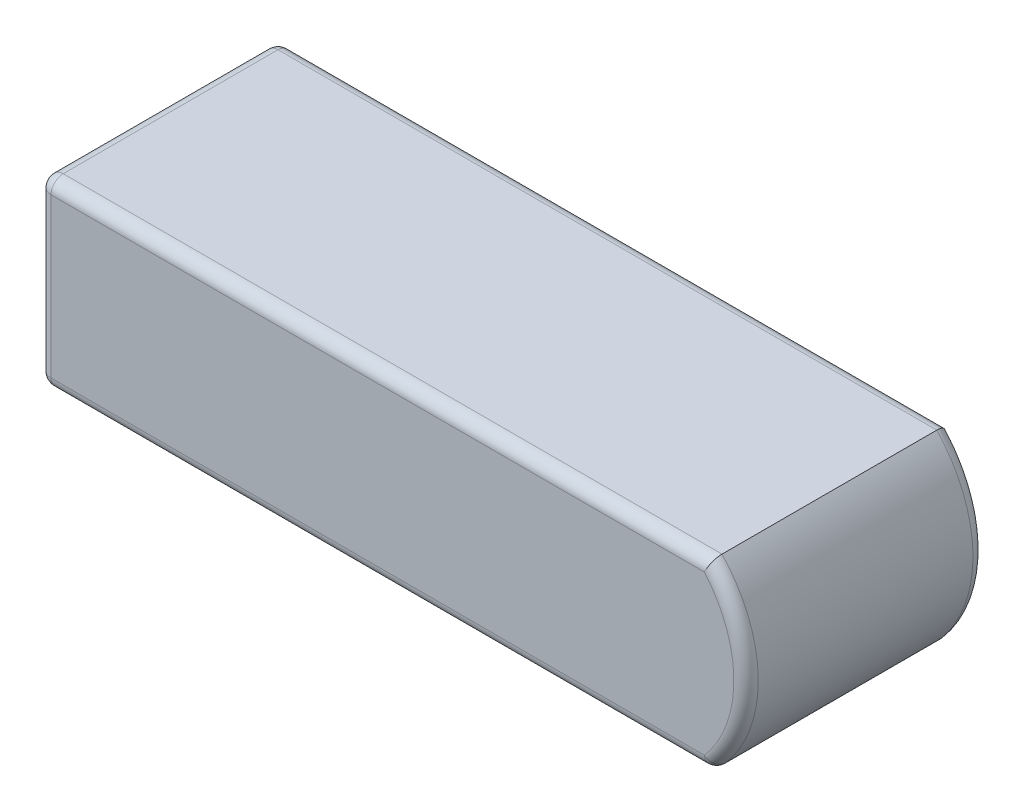
ISO-10303-21;
HEADER;
FILE_DESCRIPTION(('STEP AP214'),'2;1');
FILE_NAME('part.step','',(''),(''),'','','');
FILE_SCHEMA(('AUTOMOTIVE_DESIGN { 1 0 10303 214 1 1 1 1 }'));
ENDSEC;
DATA;
#1=APPLICATION_CONTEXT('core data for automotive mechanical design processes');
#2=APPLICATION_PROTOCOL_DEFINITION('international standard','automotive_design',2000,#1);
#3=PRODUCT_CONTEXT('',#1,'mechanical');
#4=PRODUCT('Part','Part','',(#3));
#5=PRODUCT_RELATED_PRODUCT_CATEGORY('part','',(#4));
#6=PRODUCT_DEFINITION_FORMATION('','',#4);
#7=PRODUCT_DEFINITION_CONTEXT('part definition',#1,'design');
#8=PRODUCT_DEFINITION('design','',#6,#7);
#9=PRODUCT_DEFINITION_SHAPE('','',#8);
#10=(LENGTH_UNIT() NAMED_UNIT(*) SI_UNIT(.MILLI.,.METRE.));
#11=(NAMED_UNIT(*) PLANE_ANGLE_UNIT() SI_UNIT($,.RADIAN.));
#12=(NAMED_UNIT(*) SI_UNIT($,.STERADIAN.) SOLID_ANGLE_UNIT());
#13=UNCERTAINTY_MEASURE_WITH_UNIT(LENGTH_MEASURE(1.E-05),#10,'distance_accuracy_value','');
#14=(GEOMETRIC_REPRESENTATION_CONTEXT(3) GLOBAL_UNCERTAINTY_ASSIGNED_CONTEXT((#13)) GLOBAL_UNIT_ASSIGNED_CONTEXT((#10,
#11,#12)) REPRESENTATION_CONTEXT('',''));
#15=CARTESIAN_POINT('',(0.,0.,0.));
#16=DIRECTION('',(0.,0.,1.));
#17=DIRECTION('',(1.,0.,0.));
#18=AXIS2_PLACEMENT_3D('',#15,#16,#17);
#19=CARTESIAN_POINT('',(69.2840315505781,1.27,-44.3108067642662));
#20=DIRECTION('',(0.,0.,1.));
#21=DIRECTION('',(1.,0.,0.));
#22=AXIS2_PLACEMENT_3D('',#19,#20,#21);
#23=CYLINDRICAL_SURFACE('',#22,1.27);
#24=CARTESIAN_POINT('',(69.2840315505781,1.27,-23.622));
#25=DIRECTION('',(0.,0.,-1.));
#26=DIRECTION('',(-1.,0.,0.));
#27=AXIS2_PLACEMENT_3D('',#24,#25,#26);
#28=CIRCLE('',#27,1.27);
#29=CARTESIAN_POINT('',(70.2467217052993,0.44167176433311,-23.622));
#30=VERTEX_POINT('',#29);
#31=CARTESIAN_POINT('',(69.2840315505761,0.,-23.622));
#32=VERTEX_POINT('',#31);
#33=EDGE_CURVE('E11',#30,#32,#28,.T.);
#34=ORIENTED_EDGE('',*,*,#33,.F.);
#35=DIRECTION('',(0.,0.,1.));
#36=VECTOR('',#35,1.);
#37=CARTESIAN_POINT('',(70.2467217052993,0.441671764333108,-44.3108067642662));
#38=LINE('',#37,#36);
#39=CARTESIAN_POINT('',(70.2467217052993,0.441671764333108,-1.27));
#40=VERTEX_POINT('',#39);
#41=EDGE_CURVE('E239',#40,#30,#38,.F.);
#42=ORIENTED_EDGE('',*,*,#41,.F.);
#43=CARTESIAN_POINT('',(69.2840315505781,1.27,-1.27));
#44=DIRECTION('',(0.,0.,-1.));
#45=DIRECTION('',(-1.,0.,0.));
#46=AXIS2_PLACEMENT_3D('',#43,#44,#45);
#47=CIRCLE('',#46,1.27);
#48=CARTESIAN_POINT('',(69.2840315505781,0.,-1.27));
#49=VERTEX_POINT('',#48);
#50=EDGE_CURVE('E43',#40,#49,#47,.T.);
#51=ORIENTED_EDGE('',*,*,#50,.T.);
#52=DIRECTION('',(0.,0.,1.));
#53=VECTOR('',#52,1.);
#54=CARTESIAN_POINT('',(69.2840315505781,0.,-24.892));
#55=LINE('',#54,#53);
#56=EDGE_CURVE('E230',#32,#49,#55,.T.);
#57=ORIENTED_EDGE('',*,*,#56,.F.);
#58=EDGE_LOOP('',(#34,#42,#51,#57));
#59=FACE_BOUND('',#58,.T.);
#60=ADVANCED_FACE('F35',(#59),#23,.T.);
#61=CARTESIAN_POINT('',(69.2840315505781,1.27,-1.27));
#62=DIRECTION('',(0.,0.,1.));
#63=DIRECTION('',(1.,0.,0.));
#64=AXIS2_PLACEMENT_3D('',#61,#62,#63);
#65=SPHERICAL_SURFACE('',#64,1.27);
#66=ORIENTED_EDGE('',*,*,#50,.F.);
#67=CARTESIAN_POINT('',(69.2840315505781,1.27,-1.27));
#68=DIRECTION('',(-0.652226957218023,-0.758023743874899,0.));
#69=DIRECTION('',(0.758023743874899,-0.652226957218023,0.));
#70=AXIS2_PLACEMENT_3D('',#67,#68,#69);
#71=CIRCLE('',#70,1.27);
#72=CARTESIAN_POINT('',(69.2840315505781,1.27,0.));
#73=VERTEX_POINT('',#72);
#74=EDGE_CURVE('E236',#73,#40,#71,.F.);
#75=ORIENTED_EDGE('',*,*,#74,.F.);
#76=CARTESIAN_POINT('',(69.2840315505781,1.27,-1.27));
#77=DIRECTION('',(1.,0.,0.));
#78=DIRECTION('',(0.,0.,-1.));
#79=AXIS2_PLACEMENT_3D('',#76,#77,#78);
#80=CIRCLE('',#79,1.27);
#81=EDGE_CURVE('E249',#73,#49,#80,.T.);
#82=ORIENTED_EDGE('',*,*,#81,.T.);
#83=EDGE_LOOP('',(#66,#75,#82));
#84=FACE_BOUND('',#83,.T.);
#85=ADVANCED_FACE('F252',(#84),#65,.T.);
#86=CARTESIAN_POINT('',(0.,1.27,-1.27));
#87=DIRECTION('',(-1.,0.,0.));
#88=DIRECTION('',(0.,0.,1.));
#89=AXIS2_PLACEMENT_3D('',#86,#87,#88);
#90=CYLINDRICAL_SURFACE('',#89,1.27);
#91=ORIENTED_EDGE('',*,*,#81,.F.);
#92=DIRECTION('',(1.,0.,0.));
#93=VECTOR('',#92,1.);
#94=CARTESIAN_POINT('',(0.,1.27,0.));
#95=LINE('',#94,#93);
#96=CARTESIAN_POINT('',(1.27,1.27,0.));
#97=VERTEX_POINT('',#96);
#98=EDGE_CURVE('E227',#97,#73,#95,.T.);
#99=ORIENTED_EDGE('',*,*,#98,.F.);
#100=CARTESIAN_POINT('',(1.27,1.27,-1.27));
#101=DIRECTION('',(1.,0.,0.));
#102=DIRECTION('',(0.,0.,-1.));
#103=AXIS2_PLACEMENT_3D('',#100,#101,#102);
#104=CIRCLE('',#103,1.27);
#105=CARTESIAN_POINT('',(1.27,0.,-1.27));
#106=VERTEX_POINT('',#105);
#107=EDGE_CURVE('E247',#97,#106,#104,.T.);
#108=ORIENTED_EDGE('',*,*,#107,.T.);
#109=DIRECTION('',(1.,0.,0.));
#110=VECTOR('',#109,1.);
#111=CARTESIAN_POINT('',(0.,0.,-1.27));
#112=LINE('',#111,#110);
#113=EDGE_CURVE('E233',#49,#106,#112,.F.);
#114=ORIENTED_EDGE('',*,*,#113,.F.);
#115=EDGE_LOOP('',(#91,#99,#108,#114));
#116=FACE_BOUND('',#115,.T.);
#117=ADVANCED_FACE('F255',(#116),#90,.T.);
#118=CARTESIAN_POINT('',(1.27,1.27,-1.27));
#119=DIRECTION('',(0.,0.,1.));
#120=DIRECTION('',(1.,0.,0.));
#121=AXIS2_PLACEMENT_3D('',#118,#119,#120);
#122=SPHERICAL_SURFACE('',#121,1.27);
#123=ORIENTED_EDGE('',*,*,#107,.F.);
#124=CARTESIAN_POINT('',(1.27,1.27,-1.27));
#125=DIRECTION('',(0.,-1.,0.));
#126=DIRECTION('',(0.,0.,-1.));
#127=AXIS2_PLACEMENT_3D('',#124,#125,#126);
#128=CIRCLE('',#127,1.27);
#129=CARTESIAN_POINT('',(0.,1.27,-1.27));
#130=VERTEX_POINT('',#129);
#131=EDGE_CURVE('E223',#130,#97,#128,.F.);
#132=ORIENTED_EDGE('',*,*,#131,.F.);
#133=CARTESIAN_POINT('',(1.27,1.27,-1.27));
#134=DIRECTION('',(0.,0.,-1.));
#135=DIRECTION('',(-1.,0.,0.));
#136=AXIS2_PLACEMENT_3D('',#133,#134,#135);
#137=CIRCLE('',#136,1.27);
#138=EDGE_CURVE('E145',#106,#130,#137,.T.);
#139=ORIENTED_EDGE('',*,*,#138,.F.);
#140=EDGE_LOOP('',(#123,#132,#139));
#141=FACE_BOUND('',#140,.T.);
#142=ADVANCED_FACE('F318',(#141),#122,.T.);
#143=CARTESIAN_POINT('',(69.2840315505781,1.27,-23.622));
#144=DIRECTION('',(0.,0.,1.));
#145=DIRECTION('',(1.,0.,0.));
#146=AXIS2_PLACEMENT_3D('',#143,#144,#145);
#147=SPHERICAL_SURFACE('',#146,1.27);
#148=CARTESIAN_POINT('',(69.2840315505781,1.27,-23.622));
#149=DIRECTION('',(-0.652226957218023,-0.758023743874899,0.));
#150=DIRECTION('',(0.758023743874899,-0.652226957218023,0.));
#151=AXIS2_PLACEMENT_3D('',#148,#149,#150);
#152=CIRCLE('',#151,1.27);
#153=CARTESIAN_POINT('',(69.2840315505781,1.27,-24.892));
#154=VERTEX_POINT('',#153);
#155=EDGE_CURVE('E245',#30,#154,#152,.F.);
#156=ORIENTED_EDGE('',*,*,#155,.F.);
#157=ORIENTED_EDGE('',*,*,#33,.T.);
#158=CARTESIAN_POINT('',(69.2840315505781,1.27,-23.622));
#159=DIRECTION('',(1.,0.,0.));
#160=DIRECTION('',(0.,0.,-1.));
#161=AXIS2_PLACEMENT_3D('',#158,#159,#160);
#162=CIRCLE('',#161,1.27);
#163=EDGE_CURVE('E242',#154,#32,#162,.F.);
#164=ORIENTED_EDGE('',*,*,#163,.F.);
#165=EDGE_LOOP('',(#156,#157,#164));
#166=FACE_BOUND('',#165,.T.);
#167=ADVANCED_FACE('F37',(#166),#147,.T.);
#168=CARTESIAN_POINT('',(0.,1.27,-23.622));
#169=DIRECTION('',(1.,0.,0.));
#170=DIRECTION('',(0.,0.,-1.));
#171=AXIS2_PLACEMENT_3D('',#168,#169,#170);
#172=CYLINDRICAL_SURFACE('',#171,1.27);
#173=DIRECTION('',(-1.,0.,0.));
#174=VECTOR('',#173,1.);
#175=CARTESIAN_POINT('',(0.,1.27,-24.892));
#176=LINE('',#175,#174);
#177=CARTESIAN_POINT('',(1.27,1.27,-24.892));
#178=VERTEX_POINT('',#177);
#179=EDGE_CURVE('E272',#154,#178,#176,.T.);
#180=ORIENTED_EDGE('',*,*,#179,.F.);
#181=ORIENTED_EDGE('',*,*,#163,.T.);
#182=DIRECTION('',(-1.,0.,0.));
#183=VECTOR('',#182,1.);
#184=CARTESIAN_POINT('',(0.,0.,-23.622));
#185=LINE('',#184,#183);
#186=CARTESIAN_POINT('',(1.27,0.,-23.622));
#187=VERTEX_POINT('',#186);
#188=EDGE_CURVE('E128',#187,#32,#185,.F.);
#189=ORIENTED_EDGE('',*,*,#188,.F.);
#190=CARTESIAN_POINT('',(1.27,1.27,-23.622));
#191=DIRECTION('',(-1.,0.,0.));
#192=DIRECTION('',(0.,0.,1.));
#193=AXIS2_PLACEMENT_3D('',#190,#191,#192);
#194=CIRCLE('',#193,1.27);
#195=EDGE_CURVE('E122',#178,#187,#194,.T.);
#196=ORIENTED_EDGE('',*,*,#195,.F.);
#197=EDGE_LOOP('',(#180,#181,#189,#196));
#198=FACE_BOUND('',#197,.T.);
#199=ADVANCED_FACE('F285',(#198),#172,.T.);
#200=CARTESIAN_POINT('',(59.69,9.525,-23.622));
#201=DIRECTION('',(0.,0.,1.));
#202=DIRECTION('',(1.,0.,0.));
#203=AXIS2_PLACEMENT_3D('',#200,#201,#202);
#204=TOROIDAL_SURFACE('',#203,12.6566372466579,1.27);
#205=CARTESIAN_POINT('',(59.69,9.525,-23.622));
#206=DIRECTION('',(0.,0.,1.));
#207=DIRECTION('',(1.,0.,0.));
#208=AXIS2_PLACEMENT_3D('',#205,#206,#207);
#209=CIRCLE('',#208,13.9266372466579);
#210=CARTESIAN_POINT('',(69.85,19.05,-23.622));
#211=VERTEX_POINT('',#210);
#212=EDGE_CURVE('E259',#30,#211,#209,.T.);
#213=ORIENTED_EDGE('',*,*,#212,.F.);
#214=ORIENTED_EDGE('',*,*,#155,.T.);
#215=CARTESIAN_POINT('',(59.69,9.525,-24.892));
#216=DIRECTION('',(0.,0.,1.));
#217=DIRECTION('',(1.,0.,0.));
#218=AXIS2_PLACEMENT_3D('',#215,#216,#217);
#219=CIRCLE('',#218,12.6566372466579);
#220=CARTESIAN_POINT('',(69.2840315505781,17.78,-24.892));
#221=VERTEX_POINT('',#220);
#222=EDGE_CURVE('E269',#221,#154,#219,.F.);
#223=ORIENTED_EDGE('',*,*,#222,.F.);
#224=CARTESIAN_POINT('',(69.85,19.05,-23.622));
#225=CARTESIAN_POINT('',(69.8500003511086,19.0500011803387,-23.6555813906664));
#226=CARTESIAN_POINT('',(69.8494225651869,19.0486671073925,-23.689145905236));
#227=CARTESIAN_POINT('',(69.8471206021647,19.0433543994947,-23.7560184268708));
#228=CARTESIAN_POINT('',(69.8453966655414,19.0393763192901,-23.7893264862609));
#229=CARTESIAN_POINT('',(69.8385372077815,19.0235536268872,-23.8883060424514));
#230=CARTESIAN_POINT('',(69.8317138638578,19.0078201153052,-23.9532869828456));
#231=CARTESIAN_POINT('',(69.8138217789565,18.9666319927032,-24.0793961054082));
#232=CARTESIAN_POINT('',(69.8027543188236,18.9411803145679,-24.1405254434891));
#233=CARTESIAN_POINT('',(69.776758562122,18.8815319896988,-24.2574819346519));
#234=CARTESIAN_POINT('',(69.7618287062569,18.8473318111511,-24.313306933833));
#235=CARTESIAN_POINT('',(69.7280409991254,18.7701465614472,-24.4201182150699));
#236=CARTESIAN_POINT('',(69.7090712021466,18.726911982034,-24.4708881146718));
#237=CARTESIAN_POINT('',(69.6680844970391,18.6338083355875,-24.5644818469872));
#238=CARTESIAN_POINT('',(69.6460666713571,18.5839372709377,-24.6073032778393));
#239=CARTESIAN_POINT('',(69.597740031356,18.4748827425666,-24.687346470746));
#240=CARTESIAN_POINT('',(69.5712303872767,18.4152761679141,-24.7238696512942));
#241=CARTESIAN_POINT('',(69.516029324729,18.2917015730752,-24.7864141048988));
#242=CARTESIAN_POINT('',(69.4873368101462,18.2277313634066,-24.8124300599009));
#243=CARTESIAN_POINT('',(69.4304103280996,18.1014025578751,-24.8523245285597));
#244=CARTESIAN_POINT('',(69.4022705539509,18.0392151678552,-24.8668894070195));
#245=CARTESIAN_POINT('',(69.345261923387,17.9137947674464,-24.8865215254073));
#246=CARTESIAN_POINT('',(69.3163946616471,17.8505641338985,-24.8916079707138));
#247=CARTESIAN_POINT('',(69.2863071274295,17.7849604004388,-24.8919927504372));
#248=CARTESIAN_POINT('',(69.2851693934468,17.7824800963432,-24.8920000163816));
#249=CARTESIAN_POINT('',(69.2840315505781,17.78,-24.892));
#250=B_SPLINE_CURVE_WITH_KNOTS('',3,(#224,#225,#226,#227,#228,#229,#230,#231,#232,#233,#234,
#235,#236,#237,#238,#239,#240,#241,#242,#243,#244,#245,#246,#247,#248,#249),.UNSPECIFIED.,.F.,
.F.,(4,2,2,2,2,2,2,2,2,2,2,2,4),(0.,0.100679599539039,0.201338081854139,0.401902958649163,
0.602407353941755,0.802992821972856,1.01010108365999,1.21727182762,1.44062350602395,
1.66408808885371,1.87283944614113,2.08116736566474,2.08935374739741),.UNSPECIFIED.);
#251=EDGE_CURVE('E215',#221,#211,#250,.F.);
#252=ORIENTED_EDGE('',*,*,#251,.T.);
#253=EDGE_LOOP('',(#213,#214,#223,#252));
#254=FACE_BOUND('',#253,.T.);
#255=ADVANCED_FACE('F210',(#254),#204,.T.);
#256=CARTESIAN_POINT('',(0.,17.78,-23.622));
#257=DIRECTION('',(1.,0.,0.));
#258=DIRECTION('',(0.,0.,-1.));
#259=AXIS2_PLACEMENT_3D('',#256,#257,#258);
#260=CYLINDRICAL_SURFACE('',#259,1.27);
#261=ORIENTED_EDGE('',*,*,#251,.F.);
#262=DIRECTION('',(1.,0.,0.));
#263=VECTOR('',#262,1.);
#264=CARTESIAN_POINT('',(0.,17.78,-24.892));
#265=LINE('',#264,#263);
#266=CARTESIAN_POINT('',(1.27,17.78,-24.892));
#267=VERTEX_POINT('',#266);
#268=EDGE_CURVE('E266',#267,#221,#265,.T.);
#269=ORIENTED_EDGE('',*,*,#268,.F.);
#270=CARTESIAN_POINT('',(1.27,17.78,-23.622));
#271=DIRECTION('',(1.,0.,0.));
#272=DIRECTION('',(0.,0.,-1.));
#273=AXIS2_PLACEMENT_3D('',#270,#271,#272);
#274=CIRCLE('',#273,1.27);
#275=CARTESIAN_POINT('',(1.27,19.05,-23.622));
#276=VERTEX_POINT('',#275);
#277=EDGE_CURVE('E127',#267,#276,#274,.T.);
#278=ORIENTED_EDGE('',*,*,#277,.T.);
#279=DIRECTION('',(1.,0.,0.));
#280=VECTOR('',#279,1.);
#281=CARTESIAN_POINT('',(0.,19.05,-23.622));
#282=LINE('',#281,#280);
#283=EDGE_CURVE('E261',#211,#276,#282,.F.);
#284=ORIENTED_EDGE('',*,*,#283,.F.);
#285=EDGE_LOOP('',(#261,#269,#278,#284));
#286=FACE_BOUND('',#285,.T.);
#287=ADVANCED_FACE('F205',(#286),#260,.T.);
#288=CARTESIAN_POINT('',(1.27,17.78,-23.622));
#289=DIRECTION('',(0.,0.,1.));
#290=DIRECTION('',(1.,0.,0.));
#291=AXIS2_PLACEMENT_3D('',#288,#289,#290);
#292=SPHERICAL_SURFACE('',#291,1.27);
#293=ORIENTED_EDGE('',*,*,#277,.F.);
#294=CARTESIAN_POINT('',(1.27,17.78,-23.622));
#295=DIRECTION('',(0.,-1.,0.));
#296=DIRECTION('',(0.,0.,-1.));
#297=AXIS2_PLACEMENT_3D('',#294,#295,#296);
#298=CIRCLE('',#297,1.27);
#299=CARTESIAN_POINT('',(0.,17.78,-23.622));
#300=VERTEX_POINT('',#299);
#301=EDGE_CURVE('E138',#300,#267,#298,.T.);
#302=ORIENTED_EDGE('',*,*,#301,.F.);
#303=CARTESIAN_POINT('',(1.27,17.78,-23.622));
#304=DIRECTION('',(0.,0.,1.));
#305=DIRECTION('',(1.,0.,0.));
#306=AXIS2_PLACEMENT_3D('',#303,#304,#305);
#307=CIRCLE('',#306,1.27);
#308=EDGE_CURVE('E275',#276,#300,#307,.T.);
#309=ORIENTED_EDGE('',*,*,#308,.F.);
#310=EDGE_LOOP('',(#293,#302,#309));
#311=FACE_BOUND('',#310,.T.);
#312=ADVANCED_FACE('F209',(#311),#292,.T.);
#313=CARTESIAN_POINT('',(1.27,1.27,-23.622));
#314=DIRECTION('',(0.,0.,1.));
#315=DIRECTION('',(1.,0.,0.));
#316=AXIS2_PLACEMENT_3D('',#313,#314,#315);
#317=SPHERICAL_SURFACE('',#316,1.27);
#318=CARTESIAN_POINT('',(1.27,1.27,-23.622));
#319=DIRECTION('',(0.,-1.,0.));
#320=DIRECTION('',(0.,0.,-1.));
#321=AXIS2_PLACEMENT_3D('',#318,#319,#320);
#322=CIRCLE('',#321,1.27);
#323=CARTESIAN_POINT('',(0.,1.27,-23.622));
#324=VERTEX_POINT('',#323);
#325=EDGE_CURVE('E120',#178,#324,#322,.F.);
#326=ORIENTED_EDGE('',*,*,#325,.F.);
#327=ORIENTED_EDGE('',*,*,#195,.T.);
#328=CARTESIAN_POINT('',(1.27,1.27,-23.622));
#329=DIRECTION('',(0.,0.,-1.));
#330=DIRECTION('',(-1.,0.,0.));
#331=AXIS2_PLACEMENT_3D('',#328,#329,#330);
#332=CIRCLE('',#331,1.27);
#333=EDGE_CURVE('E117',#324,#187,#332,.F.);
#334=ORIENTED_EDGE('',*,*,#333,.F.);
#335=EDGE_LOOP('',(#326,#327,#334));
#336=FACE_BOUND('',#335,.T.);
#337=ADVANCED_FACE('F119',(#336),#317,.T.);
#338=CARTESIAN_POINT('',(0.,17.78,-1.27));
#339=DIRECTION('',(-1.,0.,0.));
#340=DIRECTION('',(0.,0.,1.));
#341=AXIS2_PLACEMENT_3D('',#338,#339,#340);
#342=CYLINDRICAL_SURFACE('',#341,1.27);
#343=CARTESIAN_POINT('',(1.27,17.78,-1.27));
#344=DIRECTION('',(-1.,0.,0.));
#345=DIRECTION('',(0.,-1.,0.));
#346=AXIS2_PLACEMENT_3D('',#343,#344,#345);
#347=CIRCLE('',#346,1.27);
#348=CARTESIAN_POINT('',(1.27,17.78,0.));
#349=VERTEX_POINT('',#348);
#350=CARTESIAN_POINT('',(1.27,19.05,-1.27));
#351=VERTEX_POINT('',#350);
#352=EDGE_CURVE('E139',#349,#351,#347,.T.);
#353=ORIENTED_EDGE('',*,*,#352,.F.);
#354=DIRECTION('',(-1.,0.,0.));
#355=VECTOR('',#354,1.);
#356=CARTESIAN_POINT('',(0.,17.78,0.));
#357=LINE('',#356,#355);
#358=CARTESIAN_POINT('',(69.2840315505781,17.78,0.));
#359=VERTEX_POINT('',#358);
#360=EDGE_CURVE('E169',#359,#349,#357,.T.);
#361=ORIENTED_EDGE('',*,*,#360,.F.);
#362=CARTESIAN_POINT('',(69.85,19.05,-1.27));
#363=CARTESIAN_POINT('',(69.8500003511086,19.0500011803387,-1.2364186093336));
#364=CARTESIAN_POINT('',(69.8494225651869,19.0486671073925,-1.20285409476395));
#365=CARTESIAN_POINT('',(69.8471206021647,19.0433543994947,-1.1359815731292));
#366=CARTESIAN_POINT('',(69.8453966655414,19.0393763192901,-1.10267351373911));
#367=CARTESIAN_POINT('',(69.8385372077815,19.0235536268872,-1.00369395754862));
#368=CARTESIAN_POINT('',(69.8317138638578,19.0078201153052,-0.938713017154402));
#369=CARTESIAN_POINT('',(69.8138217789565,18.9666319927032,-0.812603894591772));
#370=CARTESIAN_POINT('',(69.8027543188236,18.9411803145679,-0.751474556510858));
#371=CARTESIAN_POINT('',(69.776758562122,18.8815319896988,-0.63451806534813));
#372=CARTESIAN_POINT('',(69.7618287062569,18.8473318111511,-0.578693066167007));
#373=CARTESIAN_POINT('',(69.7280409991254,18.7701465614472,-0.471881784930056));
#374=CARTESIAN_POINT('',(69.7090712021466,18.726911982034,-0.421111885328221));
#375=CARTESIAN_POINT('',(69.6680844970391,18.6338083355875,-0.327518153012837));
#376=CARTESIAN_POINT('',(69.6460666713571,18.5839372709377,-0.284696722160706));
#377=CARTESIAN_POINT('',(69.597740031356,18.4748827425666,-0.204653529254013));
#378=CARTESIAN_POINT('',(69.5712303872767,18.4152761679141,-0.168130348705769));
#379=CARTESIAN_POINT('',(69.516029324729,18.2917015730752,-0.10558589510122));
#380=CARTESIAN_POINT('',(69.4873368101462,18.2277313634066,-0.0795699400991189));
#381=CARTESIAN_POINT('',(69.4304103280996,18.101402557875,-0.0396754714403328));
#382=CARTESIAN_POINT('',(69.402270553951,18.0392151678551,-0.0251105929805131));
#383=CARTESIAN_POINT('',(69.3452619233869,17.9137947674465,-0.00547847459268819));
#384=CARTESIAN_POINT('',(69.3163946616466,17.8505641338988,-0.000392029286140679));
#385=CARTESIAN_POINT('',(69.2863071274295,17.7849604004388,-7.2495628296274E-06));
#386=CARTESIAN_POINT('',(69.2851693934467,17.7824800963432,1.6381551584995E-08));
#387=CARTESIAN_POINT('',(69.2840315505781,17.78,0.));
#388=B_SPLINE_CURVE_WITH_KNOTS('',3,(#362,#363,#364,#365,#366,#367,#368,#369,#370,#371,#372,
#373,#374,#375,#376,#377,#378,#379,#380,#381,#382,#383,#384,#385,#386,#387),.UNSPECIFIED.,.F.,
.F.,(4,2,2,2,2,2,2,2,2,2,2,2,4),(0.,0.100679599539041,0.201338081854138,0.401902958649164,
0.602407353941752,0.802992821972854,1.01010108365999,1.21727182762,1.44062350602395,
1.66408808885371,1.87283944614112,2.08116736566474,2.08935374739741),.UNSPECIFIED.);
#389=CARTESIAN_POINT('',(69.85,19.05,-1.27));
#390=VERTEX_POINT('',#389);
#391=EDGE_CURVE('E186',#359,#390,#388,.F.);
#392=ORIENTED_EDGE('',*,*,#391,.T.);
#393=DIRECTION('',(-1.,0.,0.));
#394=VECTOR('',#393,1.);
#395=CARTESIAN_POINT('',(0.,19.05,-1.27));
#396=LINE('',#395,#394);
#397=EDGE_CURVE('E177',#351,#390,#396,.F.);
#398=ORIENTED_EDGE('',*,*,#397,.F.);
#399=EDGE_LOOP('',(#353,#361,#392,#398));
#400=FACE_BOUND('',#399,.T.);
#401=ADVANCED_FACE('F196',(#400),#342,.T.);
#402=CARTESIAN_POINT('',(59.69,9.525,-1.27));
#403=DIRECTION('',(0.,0.,-1.));
#404=DIRECTION('',(-1.,0.,0.));
#405=AXIS2_PLACEMENT_3D('',#402,#403,#404);
#406=TOROIDAL_SURFACE('',#405,12.6566372466579,1.27);
#407=CARTESIAN_POINT('',(59.69,9.525,0.));
#408=DIRECTION('',(0.,0.,-1.));
#409=DIRECTION('',(-1.,0.,0.));
#410=AXIS2_PLACEMENT_3D('',#407,#408,#409);
#411=CIRCLE('',#410,12.6566372466579);
#412=EDGE_CURVE('E172',#73,#359,#411,.F.);
#413=ORIENTED_EDGE('',*,*,#412,.F.);
#414=ORIENTED_EDGE('',*,*,#74,.T.);
#415=CARTESIAN_POINT('',(59.69,9.525,-1.27));
#416=DIRECTION('',(0.,0.,-1.));
#417=DIRECTION('',(-1.,0.,0.));
#418=AXIS2_PLACEMENT_3D('',#415,#416,#417);
#419=CIRCLE('',#418,13.9266372466579);
#420=EDGE_CURVE('E174',#390,#40,#419,.T.);
#421=ORIENTED_EDGE('',*,*,#420,.F.);
#422=ORIENTED_EDGE('',*,*,#391,.F.);
#423=EDGE_LOOP('',(#413,#414,#421,#422));
#424=FACE_BOUND('',#423,.T.);
#425=ADVANCED_FACE('F193',(#424),#406,.T.);
#426=CARTESIAN_POINT('',(1.27,17.78,-1.27));
#427=DIRECTION('',(0.,0.,1.));
#428=DIRECTION('',(1.,0.,0.));
#429=AXIS2_PLACEMENT_3D('',#426,#427,#428);
#430=SPHERICAL_SURFACE('',#429,1.27);
#431=CARTESIAN_POINT('',(1.27,17.78,-1.27));
#432=DIRECTION('',(0.,-1.,0.));
#433=DIRECTION('',(0.,0.,-1.));
#434=AXIS2_PLACEMENT_3D('',#431,#432,#433);
#435=CIRCLE('',#434,1.27);
#436=CARTESIAN_POINT('',(0.,17.78,-1.27));
#437=VERTEX_POINT('',#436);
#438=EDGE_CURVE('E180',#349,#437,#435,.T.);
#439=ORIENTED_EDGE('',*,*,#438,.F.);
#440=ORIENTED_EDGE('',*,*,#352,.T.);
#441=CARTESIAN_POINT('',(1.27,17.78,-1.27));
#442=DIRECTION('',(0.,0.,1.));
#443=DIRECTION('',(1.,0.,0.));
#444=AXIS2_PLACEMENT_3D('',#441,#442,#443);
#445=CIRCLE('',#444,1.27);
#446=EDGE_CURVE('E183',#437,#351,#445,.F.);
#447=ORIENTED_EDGE('',*,*,#446,.F.);
#448=EDGE_LOOP('',(#439,#440,#447));
#449=FACE_BOUND('',#448,.T.);
#450=ADVANCED_FACE('F201',(#449),#430,.T.);
#451=CARTESIAN_POINT('',(0.,19.05,0.));
#452=DIRECTION('',(1.,0.,0.));
#453=DIRECTION('',(0.,0.,-1.));
#454=AXIS2_PLACEMENT_3D('',#451,#452,#453);
#455=PLANE('',#454);
#456=DIRECTION('',(0.,0.,1.));
#457=VECTOR('',#456,1.);
#458=CARTESIAN_POINT('',(0.,17.78,0.));
#459=LINE('',#458,#457);
#460=EDGE_CURVE('E156',#437,#300,#459,.F.);
#461=ORIENTED_EDGE('',*,*,#460,.T.);
#462=DIRECTION('',(0.,-1.,0.));
#463=VECTOR('',#462,1.);
#464=CARTESIAN_POINT('',(0.,19.05,-23.622));
#465=LINE('',#464,#463);
#466=EDGE_CURVE('E135',#300,#324,#465,.T.);
#467=ORIENTED_EDGE('',*,*,#466,.T.);
#468=DIRECTION('',(0.,0.,1.));
#469=VECTOR('',#468,1.);
#470=CARTESIAN_POINT('',(0.,1.27,0.));
#471=LINE('',#470,#469);
#472=EDGE_CURVE('E142',#324,#130,#471,.T.);
#473=ORIENTED_EDGE('',*,*,#472,.T.);
#474=DIRECTION('',(0.,-1.,0.));
#475=VECTOR('',#474,1.);
#476=CARTESIAN_POINT('',(0.,19.05,-1.27));
#477=LINE('',#476,#475);
#478=EDGE_CURVE('E150',#130,#437,#477,.F.);
#479=ORIENTED_EDGE('',*,*,#478,.T.);
#480=EDGE_LOOP('',(#461,#467,#473,#479));
#481=FACE_BOUND('',#480,.T.);
#482=ADVANCED_FACE('F154',(#481),#455,.F.);
#483=CARTESIAN_POINT('',(0.,19.05,0.));
#484=DIRECTION('',(0.,0.,-1.));
#485=DIRECTION('',(-1.,0.,0.));
#486=AXIS2_PLACEMENT_3D('',#483,#484,#485);
#487=PLANE('',#486);
#488=DIRECTION('',(0.,-1.,0.));
#489=VECTOR('',#488,1.);
#490=CARTESIAN_POINT('',(1.27,19.05,0.));
#491=LINE('',#490,#489);
#492=EDGE_CURVE('E164',#349,#97,#491,.T.);
#493=ORIENTED_EDGE('',*,*,#492,.T.);
#494=ORIENTED_EDGE('',*,*,#98,.T.);
#495=ORIENTED_EDGE('',*,*,#412,.T.);
#496=ORIENTED_EDGE('',*,*,#360,.T.);
#497=EDGE_LOOP('',(#493,#494,#495,#496));
#498=FACE_BOUND('',#497,.T.);
#499=ADVANCED_FACE('F328',(#498),#487,.F.);
#500=CARTESIAN_POINT('',(0.,19.05,-24.892));
#501=DIRECTION('',(0.,0.,1.));
#502=DIRECTION('',(1.,0.,0.));
#503=AXIS2_PLACEMENT_3D('',#500,#501,#502);
#504=PLANE('',#503);
#505=DIRECTION('',(0.,-1.,0.));
#506=VECTOR('',#505,1.);
#507=CARTESIAN_POINT('',(1.27,19.05,-24.892));
#508=LINE('',#507,#506);
#509=EDGE_CURVE('E137',#178,#267,#508,.F.);
#510=ORIENTED_EDGE('',*,*,#509,.T.);
#511=ORIENTED_EDGE('',*,*,#268,.T.);
#512=ORIENTED_EDGE('',*,*,#222,.T.);
#513=ORIENTED_EDGE('',*,*,#179,.T.);
#514=EDGE_LOOP('',(#510,#511,#512,#513));
#515=FACE_BOUND('',#514,.T.);
#516=ADVANCED_FACE('F281',(#515),#504,.F.);
#517=CARTESIAN_POINT('',(0.,19.05,-24.892));
#518=DIRECTION('',(0.,-1.,0.));
#519=DIRECTION('',(0.,0.,-1.));
#520=AXIS2_PLACEMENT_3D('',#517,#518,#519);
#521=PLANE('',#520);
#522=DIRECTION('',(0.,0.,-1.));
#523=VECTOR('',#522,1.);
#524=CARTESIAN_POINT('',(69.85,19.05,0.));
#525=LINE('',#524,#523);
#526=EDGE_CURVE('E151',#390,#211,#525,.T.);
#527=ORIENTED_EDGE('',*,*,#526,.T.);
#528=ORIENTED_EDGE('',*,*,#283,.T.);
#529=DIRECTION('',(0.,0.,1.));
#530=VECTOR('',#529,1.);
#531=CARTESIAN_POINT('',(1.27,19.05,-24.892));
#532=LINE('',#531,#530);
#533=EDGE_CURVE('E158',#276,#351,#532,.T.);
#534=ORIENTED_EDGE('',*,*,#533,.T.);
#535=ORIENTED_EDGE('',*,*,#397,.T.);
#536=EDGE_LOOP('',(#527,#528,#534,#535));
#537=FACE_BOUND('',#536,.T.);
#538=ADVANCED_FACE('F297',(#537),#521,.F.);
#539=CARTESIAN_POINT('',(0.,0.,-24.892));
#540=DIRECTION('',(0.,-1.,0.));
#541=DIRECTION('',(0.,0.,-1.));
#542=AXIS2_PLACEMENT_3D('',#539,#540,#541);
#543=PLANE('',#542);
#544=ORIENTED_EDGE('',*,*,#56,.T.);
#545=ORIENTED_EDGE('',*,*,#113,.T.);
#546=DIRECTION('',(0.,0.,1.));
#547=VECTOR('',#546,1.);
#548=CARTESIAN_POINT('',(1.27,0.,-24.892));
#549=LINE('',#548,#547);
#550=EDGE_CURVE('E167',#106,#187,#549,.F.);
#551=ORIENTED_EDGE('',*,*,#550,.T.);
#552=ORIENTED_EDGE('',*,*,#188,.T.);
#553=EDGE_LOOP('',(#544,#545,#551,#552));
#554=FACE_BOUND('',#553,.T.);
#555=ADVANCED_FACE('F257',(#554),#543,.T.);
#556=CARTESIAN_POINT('',(1.27,19.05,-1.27));
#557=DIRECTION('',(0.,-1.,0.));
#558=DIRECTION('',(0.,0.,-1.));
#559=AXIS2_PLACEMENT_3D('',#556,#557,#558);
#560=CYLINDRICAL_SURFACE('',#559,1.27);
#561=ORIENTED_EDGE('',*,*,#478,.F.);
#562=ORIENTED_EDGE('',*,*,#131,.T.);
#563=ORIENTED_EDGE('',*,*,#492,.F.);
#564=ORIENTED_EDGE('',*,*,#438,.T.);
#565=EDGE_LOOP('',(#561,#562,#563,#564));
#566=FACE_BOUND('',#565,.T.);
#567=ADVANCED_FACE('F327',(#566),#560,.T.);
#568=CARTESIAN_POINT('',(1.27,17.78,-24.892));
#569=DIRECTION('',(0.,0.,1.));
#570=DIRECTION('',(1.,0.,0.));
#571=AXIS2_PLACEMENT_3D('',#568,#569,#570);
#572=CYLINDRICAL_SURFACE('',#571,1.27);
#573=ORIENTED_EDGE('',*,*,#533,.F.);
#574=ORIENTED_EDGE('',*,*,#308,.T.);
#575=ORIENTED_EDGE('',*,*,#460,.F.);
#576=ORIENTED_EDGE('',*,*,#446,.T.);
#577=EDGE_LOOP('',(#573,#574,#575,#576));
#578=FACE_BOUND('',#577,.T.);
#579=ADVANCED_FACE('F303',(#578),#572,.T.);
#580=CARTESIAN_POINT('',(1.27,1.27,0.));
#581=DIRECTION('',(0.,0.,-1.));
#582=DIRECTION('',(-1.,0.,0.));
#583=AXIS2_PLACEMENT_3D('',#580,#581,#582);
#584=CYLINDRICAL_SURFACE('',#583,1.27);
#585=ORIENTED_EDGE('',*,*,#550,.F.);
#586=ORIENTED_EDGE('',*,*,#138,.T.);
#587=ORIENTED_EDGE('',*,*,#472,.F.);
#588=ORIENTED_EDGE('',*,*,#333,.T.);
#589=EDGE_LOOP('',(#585,#586,#587,#588));
#590=FACE_BOUND('',#589,.T.);
#591=ADVANCED_FACE('F143',(#590),#584,.T.);
#592=CARTESIAN_POINT('',(1.27,19.05,-23.622));
#593=DIRECTION('',(0.,-1.,0.));
#594=DIRECTION('',(0.,0.,-1.));
#595=AXIS2_PLACEMENT_3D('',#592,#593,#594);
#596=CYLINDRICAL_SURFACE('',#595,1.27);
#597=ORIENTED_EDGE('',*,*,#466,.F.);
#598=ORIENTED_EDGE('',*,*,#301,.T.);
#599=ORIENTED_EDGE('',*,*,#509,.F.);
#600=ORIENTED_EDGE('',*,*,#325,.T.);
#601=EDGE_LOOP('',(#597,#598,#599,#600));
#602=FACE_BOUND('',#601,.T.);
#603=ADVANCED_FACE('F132',(#602),#596,.T.);
#604=CARTESIAN_POINT('',(59.69,9.525,-44.3108067642662));
#605=DIRECTION('',(0.,0.,1.));
#606=DIRECTION('',(1.,0.,0.));
#607=AXIS2_PLACEMENT_3D('',#604,#605,#606);
#608=CYLINDRICAL_SURFACE('',#607,13.9266372466579);
#609=ORIENTED_EDGE('',*,*,#420,.T.);
#610=ORIENTED_EDGE('',*,*,#41,.T.);
#611=ORIENTED_EDGE('',*,*,#212,.T.);
#612=ORIENTED_EDGE('',*,*,#526,.F.);
#613=EDGE_LOOP('',(#609,#610,#611,#612));
#614=FACE_BOUND('',#613,.T.);
#615=ADVANCED_FACE('F291',(#614),#608,.T.);
#616=CLOSED_SHELL('',(#60,#85,#117,#142,#167,#199,#255,#287,#312,#337,#401,#425,#450,#482,#499,
#516,#538,#555,#567,#579,#591,#603,#615));
#617=MANIFOLD_SOLID_BREP('B2',#616);
#618=ADVANCED_BREP_SHAPE_REPRESENTATION('',(#18,#617),#14);
#619=SHAPE_DEFINITION_REPRESENTATION(#9,#618);
ENDSEC;
END-ISO-10303-21;
